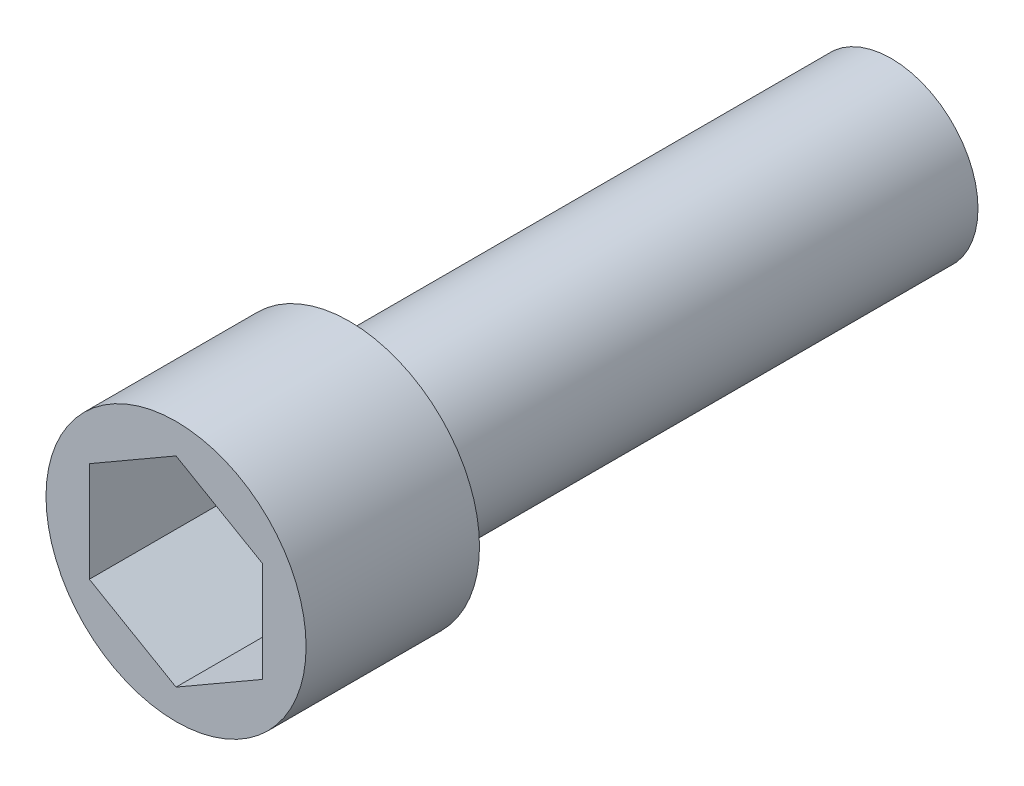
ISO-10303-21;
HEADER;
FILE_DESCRIPTION(('STEP AP214'),'2;1');
FILE_NAME('part.step','',(''),(''),'','','');
FILE_SCHEMA(('AUTOMOTIVE_DESIGN { 1 0 10303 214 1 1 1 1 }'));
ENDSEC;
DATA;
#1=APPLICATION_CONTEXT('core data for automotive mechanical design processes');
#2=APPLICATION_PROTOCOL_DEFINITION('international standard','automotive_design',2000,#1);
#3=PRODUCT_CONTEXT('',#1,'mechanical');
#4=PRODUCT('Part','Part','',(#3));
#5=PRODUCT_RELATED_PRODUCT_CATEGORY('part','',(#4));
#6=PRODUCT_DEFINITION_FORMATION('','',#4);
#7=PRODUCT_DEFINITION_CONTEXT('part definition',#1,'design');
#8=PRODUCT_DEFINITION('design','',#6,#7);
#9=PRODUCT_DEFINITION_SHAPE('','',#8);
#10=(LENGTH_UNIT() NAMED_UNIT(*) SI_UNIT(.MILLI.,.METRE.));
#11=(NAMED_UNIT(*) PLANE_ANGLE_UNIT() SI_UNIT($,.RADIAN.));
#12=(NAMED_UNIT(*) SI_UNIT($,.STERADIAN.) SOLID_ANGLE_UNIT());
#13=UNCERTAINTY_MEASURE_WITH_UNIT(LENGTH_MEASURE(1.E-05),#10,'distance_accuracy_value','');
#14=(GEOMETRIC_REPRESENTATION_CONTEXT(3) GLOBAL_UNCERTAINTY_ASSIGNED_CONTEXT((#13)) GLOBAL_UNIT_ASSIGNED_CONTEXT((#10,
#11,#12)) REPRESENTATION_CONTEXT('',''));
#15=CARTESIAN_POINT('',(0.,0.,0.));
#16=DIRECTION('',(0.,0.,1.));
#17=DIRECTION('',(1.,0.,0.));
#18=AXIS2_PLACEMENT_3D('',#15,#16,#17);
#19=CARTESIAN_POINT('',(0.,0.,-8.));
#20=DIRECTION('',(0.,0.,1.));
#21=DIRECTION('',(1.,0.,0.));
#22=AXIS2_PLACEMENT_3D('',#19,#20,#21);
#23=CYLINDRICAL_SURFACE('',#22,6.);
#24=CARTESIAN_POINT('',(0.,0.,-8.));
#25=DIRECTION('',(0.,0.,1.));
#26=DIRECTION('',(1.,0.,0.));
#27=AXIS2_PLACEMENT_3D('',#24,#25,#26);
#28=CIRCLE('',#27,6.);
#29=CARTESIAN_POINT('',(6.,0.,-8.));
#30=VERTEX_POINT('',#29);
#31=EDGE_CURVE('E11',#30,#30,#28,.T.);
#32=ORIENTED_EDGE('',*,*,#31,.T.);
#33=EDGE_LOOP('',(#32));
#34=FACE_BOUND('',#33,.T.);
#35=CARTESIAN_POINT('',(0.,0.,0.));
#36=DIRECTION('',(0.,0.,1.));
#37=DIRECTION('',(1.,0.,0.));
#38=AXIS2_PLACEMENT_3D('',#35,#36,#37);
#39=CIRCLE('',#38,6.);
#40=CARTESIAN_POINT('',(6.,0.,0.));
#41=VERTEX_POINT('',#40);
#42=EDGE_CURVE('E42',#41,#41,#39,.T.);
#43=ORIENTED_EDGE('',*,*,#42,.F.);
#44=EDGE_LOOP('',(#43));
#45=FACE_BOUND('',#44,.T.);
#46=ADVANCED_FACE('F39',(#34,#45),#23,.T.);
#47=CARTESIAN_POINT('',(0.,0.,-8.));
#48=DIRECTION('',(0.,0.,1.));
#49=DIRECTION('',(1.,0.,0.));
#50=AXIS2_PLACEMENT_3D('',#47,#48,#49);
#51=PLANE('',#50);
#52=CARTESIAN_POINT('',(0.,0.,-8.));
#53=DIRECTION('',(0.,0.,1.));
#54=DIRECTION('',(1.,0.,0.));
#55=AXIS2_PLACEMENT_3D('',#52,#53,#54);
#56=CIRCLE('',#55,4.);
#57=CARTESIAN_POINT('',(4.,0.,-8.));
#58=VERTEX_POINT('',#57);
#59=EDGE_CURVE('E148',#58,#58,#56,.T.);
#60=ORIENTED_EDGE('',*,*,#59,.T.);
#61=EDGE_LOOP('',(#60));
#62=FACE_BOUND('',#61,.T.);
#63=ORIENTED_EDGE('',*,*,#31,.F.);
#64=EDGE_LOOP('',(#63));
#65=FACE_BOUND('',#64,.T.);
#66=ADVANCED_FACE('F158',(#62,#65),#51,.F.);
#67=CARTESIAN_POINT('',(0.,0.,0.));
#68=DIRECTION('',(0.,0.,1.));
#69=DIRECTION('',(1.,0.,0.));
#70=AXIS2_PLACEMENT_3D('',#67,#68,#69);
#71=PLANE('',#70);
#72=DIRECTION('',(-0.866025403784441,0.499999999999995,0.));
#73=VECTOR('',#72,1.);
#74=CARTESIAN_POINT('',(3.99999999999998,2.30940107675855,0.));
#75=LINE('',#74,#73);
#76=CARTESIAN_POINT('',(3.99999999999998,2.30940107675855,0.));
#77=VERTEX_POINT('',#76);
#78=CARTESIAN_POINT('',(0.,4.61880215351701,0.));
#79=VERTEX_POINT('',#78);
#80=EDGE_CURVE('E53',#77,#79,#75,.T.);
#81=ORIENTED_EDGE('',*,*,#80,.F.);
#82=DIRECTION('',(0.,1.,0.));
#83=VECTOR('',#82,1.);
#84=CARTESIAN_POINT('',(4.00000000000002,-2.30940107675847,0.));
#85=LINE('',#84,#83);
#86=CARTESIAN_POINT('',(4.00000000000002,-2.30940107675847,0.));
#87=VERTEX_POINT('',#86);
#88=EDGE_CURVE('E136',#87,#77,#85,.T.);
#89=ORIENTED_EDGE('',*,*,#88,.F.);
#90=DIRECTION('',(0.866025403784434,0.500000000000007,0.));
#91=VECTOR('',#90,1.);
#92=CARTESIAN_POINT('',(0.,-4.61880215351701,0.));
#93=LINE('',#92,#91);
#94=CARTESIAN_POINT('',(0.,-4.61880215351701,0.));
#95=VERTEX_POINT('',#94);
#96=EDGE_CURVE('E134',#95,#87,#93,.T.);
#97=ORIENTED_EDGE('',*,*,#96,.F.);
#98=DIRECTION('',(0.866025403784441,-0.499999999999995,0.));
#99=VECTOR('',#98,1.);
#100=CARTESIAN_POINT('',(-3.99999999999999,-2.30940107675852,0.));
#101=LINE('',#100,#99);
#102=CARTESIAN_POINT('',(-3.99999999999999,-2.30940107675852,0.));
#103=VERTEX_POINT('',#102);
#104=EDGE_CURVE('E101',#103,#95,#101,.T.);
#105=ORIENTED_EDGE('',*,*,#104,.F.);
#106=DIRECTION('',(0.,-1.,0.));
#107=VECTOR('',#106,1.);
#108=CARTESIAN_POINT('',(-4.00000000000001,2.3094010767585,0.));
#109=LINE('',#108,#107);
#110=CARTESIAN_POINT('',(-4.00000000000001,2.3094010767585,0.));
#111=VERTEX_POINT('',#110);
#112=EDGE_CURVE('E130',#111,#103,#109,.T.);
#113=ORIENTED_EDGE('',*,*,#112,.F.);
#114=DIRECTION('',(-0.866025403784438,-0.500000000000001,0.));
#115=VECTOR('',#114,1.);
#116=CARTESIAN_POINT('',(0.,4.61880215351701,0.));
#117=LINE('',#116,#115);
#118=EDGE_CURVE('E127',#79,#111,#117,.T.);
#119=ORIENTED_EDGE('',*,*,#118,.F.);
#120=EDGE_LOOP('',(#81,#89,#97,#105,#113,#119));
#121=FACE_BOUND('',#120,.T.);
#122=ORIENTED_EDGE('',*,*,#42,.T.);
#123=EDGE_LOOP('',(#122));
#124=FACE_BOUND('',#123,.T.);
#125=ADVANCED_FACE('F155',(#121,#124),#71,.T.);
#126=CARTESIAN_POINT('',(0.,0.,-33.));
#127=DIRECTION('',(0.,0.,1.));
#128=DIRECTION('',(1.,0.,0.));
#129=AXIS2_PLACEMENT_3D('',#126,#127,#128);
#130=CYLINDRICAL_SURFACE('',#129,4.);
#131=CARTESIAN_POINT('',(0.,0.,-33.));
#132=DIRECTION('',(0.,0.,1.));
#133=DIRECTION('',(1.,0.,0.));
#134=AXIS2_PLACEMENT_3D('',#131,#132,#133);
#135=CIRCLE('',#134,4.);
#136=CARTESIAN_POINT('',(4.,0.,-33.));
#137=VERTEX_POINT('',#136);
#138=EDGE_CURVE('E140',#137,#137,#135,.T.);
#139=ORIENTED_EDGE('',*,*,#138,.T.);
#140=EDGE_LOOP('',(#139));
#141=FACE_BOUND('',#140,.T.);
#142=ORIENTED_EDGE('',*,*,#59,.F.);
#143=EDGE_LOOP('',(#142));
#144=FACE_BOUND('',#143,.T.);
#145=ADVANCED_FACE('F170',(#141,#144),#130,.T.);
#146=CARTESIAN_POINT('',(0.,0.,-33.));
#147=DIRECTION('',(0.,0.,1.));
#148=DIRECTION('',(1.,0.,0.));
#149=AXIS2_PLACEMENT_3D('',#146,#147,#148);
#150=PLANE('',#149);
#151=ORIENTED_EDGE('',*,*,#138,.F.);
#152=EDGE_LOOP('',(#151));
#153=FACE_BOUND('',#152,.T.);
#154=ADVANCED_FACE('F174',(#153),#150,.F.);
#155=CARTESIAN_POINT('',(3.99999999999998,2.30940107675855,-6.));
#156=DIRECTION('',(0.499999999999995,0.866025403784441,0.));
#157=DIRECTION('',(-0.866025403784441,0.499999999999995,0.));
#158=AXIS2_PLACEMENT_3D('',#155,#156,#157);
#159=PLANE('',#158);
#160=ORIENTED_EDGE('',*,*,#80,.T.);
#161=DIRECTION('',(0.,0.,1.));
#162=VECTOR('',#161,1.);
#163=CARTESIAN_POINT('',(0.,4.61880215351701,-6.));
#164=LINE('',#163,#162);
#165=CARTESIAN_POINT('',(0.,4.61880215351701,-6.));
#166=VERTEX_POINT('',#165);
#167=EDGE_CURVE('E83',#166,#79,#164,.T.);
#168=ORIENTED_EDGE('',*,*,#167,.F.);
#169=DIRECTION('',(-0.866025403784441,0.499999999999995,0.));
#170=VECTOR('',#169,1.);
#171=CARTESIAN_POINT('',(3.99999999999998,2.30940107675855,-6.));
#172=LINE('',#171,#170);
#173=CARTESIAN_POINT('',(3.99999999999998,2.30940107675855,-6.));
#174=VERTEX_POINT('',#173);
#175=EDGE_CURVE('E138',#174,#166,#172,.T.);
#176=ORIENTED_EDGE('',*,*,#175,.F.);
#177=DIRECTION('',(0.,0.,1.));
#178=VECTOR('',#177,1.);
#179=CARTESIAN_POINT('',(3.99999999999998,2.30940107675855,-6.));
#180=LINE('',#179,#178);
#181=EDGE_CURVE('E61',#174,#77,#180,.T.);
#182=ORIENTED_EDGE('',*,*,#181,.T.);
#183=EDGE_LOOP('',(#160,#168,#176,#182));
#184=FACE_BOUND('',#183,.T.);
#185=ADVANCED_FACE('F178',(#184),#159,.F.);
#186=CARTESIAN_POINT('',(4.00000000000002,-2.30940107675847,-6.));
#187=DIRECTION('',(1.,0.,0.));
#188=DIRECTION('',(0.,1.,0.));
#189=AXIS2_PLACEMENT_3D('',#186,#187,#188);
#190=PLANE('',#189);
#191=ORIENTED_EDGE('',*,*,#88,.T.);
#192=ORIENTED_EDGE('',*,*,#181,.F.);
#193=DIRECTION('',(0.,1.,0.));
#194=VECTOR('',#193,1.);
#195=CARTESIAN_POINT('',(4.00000000000002,-2.30940107675847,-6.));
#196=LINE('',#195,#194);
#197=CARTESIAN_POINT('',(4.00000000000002,-2.30940107675847,-6.));
#198=VERTEX_POINT('',#197);
#199=EDGE_CURVE('E113',#198,#174,#196,.T.);
#200=ORIENTED_EDGE('',*,*,#199,.F.);
#201=DIRECTION('',(0.,0.,1.));
#202=VECTOR('',#201,1.);
#203=CARTESIAN_POINT('',(4.00000000000002,-2.30940107675847,-6.));
#204=LINE('',#203,#202);
#205=EDGE_CURVE('E105',#198,#87,#204,.T.);
#206=ORIENTED_EDGE('',*,*,#205,.T.);
#207=EDGE_LOOP('',(#191,#192,#200,#206));
#208=FACE_BOUND('',#207,.T.);
#209=ADVANCED_FACE('F182',(#208),#190,.F.);
#210=CARTESIAN_POINT('',(0.,-4.61880215351701,-6.));
#211=DIRECTION('',(0.500000000000007,-0.866025403784434,0.));
#212=DIRECTION('',(0.866025403784435,0.500000000000007,0.));
#213=AXIS2_PLACEMENT_3D('',#210,#211,#212);
#214=PLANE('',#213);
#215=ORIENTED_EDGE('',*,*,#96,.T.);
#216=ORIENTED_EDGE('',*,*,#205,.F.);
#217=DIRECTION('',(0.866025403784434,0.500000000000007,0.));
#218=VECTOR('',#217,1.);
#219=CARTESIAN_POINT('',(0.,-4.61880215351701,-6.));
#220=LINE('',#219,#218);
#221=CARTESIAN_POINT('',(0.,-4.61880215351701,-6.));
#222=VERTEX_POINT('',#221);
#223=EDGE_CURVE('E109',#222,#198,#220,.T.);
#224=ORIENTED_EDGE('',*,*,#223,.F.);
#225=DIRECTION('',(0.,0.,1.));
#226=VECTOR('',#225,1.);
#227=CARTESIAN_POINT('',(0.,-4.61880215351701,-6.));
#228=LINE('',#227,#226);
#229=EDGE_CURVE('E94',#222,#95,#228,.T.);
#230=ORIENTED_EDGE('',*,*,#229,.T.);
#231=EDGE_LOOP('',(#215,#216,#224,#230));
#232=FACE_BOUND('',#231,.T.);
#233=ADVANCED_FACE('F110',(#232),#214,.F.);
#234=CARTESIAN_POINT('',(-3.99999999999999,-2.30940107675852,-6.));
#235=DIRECTION('',(-0.499999999999995,-0.866025403784442,0.));
#236=DIRECTION('',(0.866025403784442,-0.499999999999995,0.));
#237=AXIS2_PLACEMENT_3D('',#234,#235,#236);
#238=PLANE('',#237);
#239=ORIENTED_EDGE('',*,*,#104,.T.);
#240=ORIENTED_EDGE('',*,*,#229,.F.);
#241=DIRECTION('',(0.866025403784441,-0.499999999999995,0.));
#242=VECTOR('',#241,1.);
#243=CARTESIAN_POINT('',(-3.99999999999999,-2.30940107675852,-6.));
#244=LINE('',#243,#242);
#245=CARTESIAN_POINT('',(-3.99999999999999,-2.30940107675852,-6.));
#246=VERTEX_POINT('',#245);
#247=EDGE_CURVE('E98',#246,#222,#244,.T.);
#248=ORIENTED_EDGE('',*,*,#247,.F.);
#249=DIRECTION('',(0.,0.,1.));
#250=VECTOR('',#249,1.);
#251=CARTESIAN_POINT('',(-3.99999999999999,-2.30940107675852,-6.));
#252=LINE('',#251,#250);
#253=EDGE_CURVE('E106',#246,#103,#252,.T.);
#254=ORIENTED_EDGE('',*,*,#253,.T.);
#255=EDGE_LOOP('',(#239,#240,#248,#254));
#256=FACE_BOUND('',#255,.T.);
#257=ADVANCED_FACE('F96',(#256),#238,.F.);
#258=CARTESIAN_POINT('',(-4.00000000000001,2.3094010767585,-6.));
#259=DIRECTION('',(-1.,0.,0.));
#260=DIRECTION('',(0.,-1.,0.));
#261=AXIS2_PLACEMENT_3D('',#258,#259,#260);
#262=PLANE('',#261);
#263=ORIENTED_EDGE('',*,*,#112,.T.);
#264=ORIENTED_EDGE('',*,*,#253,.F.);
#265=DIRECTION('',(0.,-1.,0.));
#266=VECTOR('',#265,1.);
#267=CARTESIAN_POINT('',(-4.00000000000001,2.3094010767585,-6.));
#268=LINE('',#267,#266);
#269=CARTESIAN_POINT('',(-4.00000000000001,2.3094010767585,-6.));
#270=VERTEX_POINT('',#269);
#271=EDGE_CURVE('E119',#270,#246,#268,.T.);
#272=ORIENTED_EDGE('',*,*,#271,.F.);
#273=DIRECTION('',(0.,0.,1.));
#274=VECTOR('',#273,1.);
#275=CARTESIAN_POINT('',(-4.00000000000001,2.3094010767585,-6.));
#276=LINE('',#275,#274);
#277=EDGE_CURVE('E143',#270,#111,#276,.T.);
#278=ORIENTED_EDGE('',*,*,#277,.T.);
#279=EDGE_LOOP('',(#263,#264,#272,#278));
#280=FACE_BOUND('',#279,.T.);
#281=ADVANCED_FACE('F186',(#280),#262,.F.);
#282=CARTESIAN_POINT('',(0.,4.61880215351701,-6.));
#283=DIRECTION('',(-0.500000000000001,0.866025403784438,0.));
#284=DIRECTION('',(-0.866025403784438,-0.500000000000001,0.));
#285=AXIS2_PLACEMENT_3D('',#282,#283,#284);
#286=PLANE('',#285);
#287=ORIENTED_EDGE('',*,*,#118,.T.);
#288=ORIENTED_EDGE('',*,*,#277,.F.);
#289=DIRECTION('',(-0.866025403784438,-0.500000000000001,0.));
#290=VECTOR('',#289,1.);
#291=CARTESIAN_POINT('',(0.,4.61880215351701,-6.));
#292=LINE('',#291,#290);
#293=EDGE_CURVE('E121',#166,#270,#292,.T.);
#294=ORIENTED_EDGE('',*,*,#293,.F.);
#295=ORIENTED_EDGE('',*,*,#167,.T.);
#296=EDGE_LOOP('',(#287,#288,#294,#295));
#297=FACE_BOUND('',#296,.T.);
#298=ADVANCED_FACE('F183',(#297),#286,.F.);
#299=CARTESIAN_POINT('',(0.,0.,-6.));
#300=DIRECTION('',(0.,0.,1.));
#301=DIRECTION('',(1.,0.,0.));
#302=AXIS2_PLACEMENT_3D('',#299,#300,#301);
#303=PLANE('',#302);
#304=ORIENTED_EDGE('',*,*,#175,.T.);
#305=ORIENTED_EDGE('',*,*,#293,.T.);
#306=ORIENTED_EDGE('',*,*,#271,.T.);
#307=ORIENTED_EDGE('',*,*,#247,.T.);
#308=ORIENTED_EDGE('',*,*,#223,.T.);
#309=ORIENTED_EDGE('',*,*,#199,.T.);
#310=EDGE_LOOP('',(#304,#305,#306,#307,#308,#309));
#311=FACE_BOUND('',#310,.T.);
#312=ADVANCED_FACE('F116',(#311),#303,.T.);
#313=CLOSED_SHELL('',(#46,#66,#125,#145,#154,#185,#209,#233,#257,#281,#298,#312));
#314=MANIFOLD_SOLID_BREP('B2',#313);
#315=ADVANCED_BREP_SHAPE_REPRESENTATION('',(#18,#314),#14);
#316=SHAPE_DEFINITION_REPRESENTATION(#9,#315);
ENDSEC;
END-ISO-10303-21;
